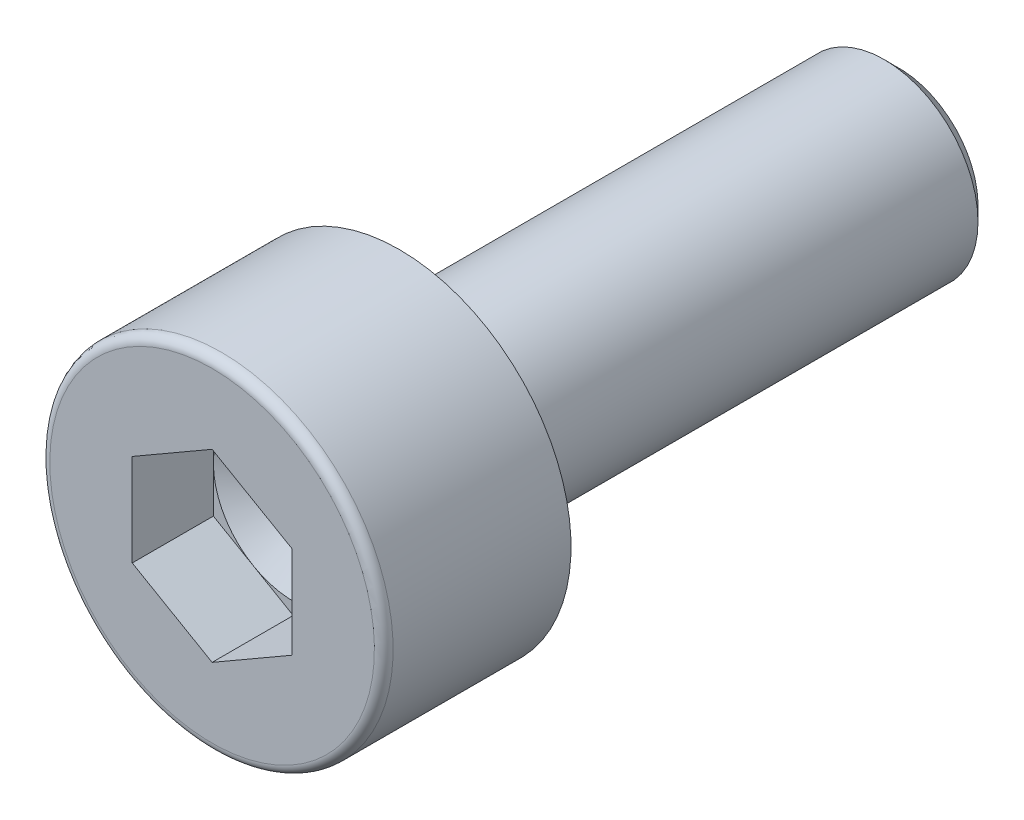
ISO-10303-21;
HEADER;
FILE_DESCRIPTION(('STEP AP214'),'2;1');
FILE_NAME('part.step','',(''),(''),'','','');
FILE_SCHEMA(('AUTOMOTIVE_DESIGN { 1 0 10303 214 1 1 1 1 }'));
ENDSEC;
DATA;
#1=APPLICATION_CONTEXT('core data for automotive mechanical design processes');
#2=APPLICATION_PROTOCOL_DEFINITION('international standard','automotive_design',2000,#1);
#3=PRODUCT_CONTEXT('',#1,'mechanical');
#4=PRODUCT('Part','Part','',(#3));
#5=PRODUCT_RELATED_PRODUCT_CATEGORY('part','',(#4));
#6=PRODUCT_DEFINITION_FORMATION('','',#4);
#7=PRODUCT_DEFINITION_CONTEXT('part definition',#1,'design');
#8=PRODUCT_DEFINITION('design','',#6,#7);
#9=PRODUCT_DEFINITION_SHAPE('','',#8);
#10=(LENGTH_UNIT() NAMED_UNIT(*) SI_UNIT(.MILLI.,.METRE.));
#11=(NAMED_UNIT(*) PLANE_ANGLE_UNIT() SI_UNIT($,.RADIAN.));
#12=(NAMED_UNIT(*) SI_UNIT($,.STERADIAN.) SOLID_ANGLE_UNIT());
#13=UNCERTAINTY_MEASURE_WITH_UNIT(LENGTH_MEASURE(1.E-05),#10,'distance_accuracy_value','');
#14=(GEOMETRIC_REPRESENTATION_CONTEXT(3) GLOBAL_UNCERTAINTY_ASSIGNED_CONTEXT((#13)) GLOBAL_UNIT_ASSIGNED_CONTEXT((#10,
#11,#12)) REPRESENTATION_CONTEXT('',''));
#15=CARTESIAN_POINT('',(0.,0.,0.));
#16=DIRECTION('',(0.,0.,1.));
#17=DIRECTION('',(1.,0.,0.));
#18=AXIS2_PLACEMENT_3D('',#15,#16,#17);
#19=CARTESIAN_POINT('',(0.,1.47801668912544,1.7));
#20=DIRECTION('',(0.,0.,1.));
#21=DIRECTION('',(1.,0.,0.));
#22=AXIS2_PLACEMENT_3D('',#19,#20,#21);
#23=PLANE('',#22);
#24=DIRECTION('',(0.,-1.,0.));
#25=VECTOR('',#24,1.);
#26=CARTESIAN_POINT('',(-1.28,0.739008344562722,1.7));
#27=LINE('',#26,#25);
#28=CARTESIAN_POINT('',(-1.28,0.739008344562722,1.7));
#29=VERTEX_POINT('',#28);
#30=CARTESIAN_POINT('',(-1.28,0.,1.7));
#31=VERTEX_POINT('',#30);
#32=EDGE_CURVE('E145',#29,#31,#27,.T.);
#33=ORIENTED_EDGE('',*,*,#32,.T.);
#34=CARTESIAN_POINT('',(0.,0.,1.7));
#35=DIRECTION('',(0.,0.,-1.));
#36=DIRECTION('',(-1.,0.,0.));
#37=AXIS2_PLACEMENT_3D('',#34,#35,#36);
#38=CIRCLE('',#37,1.28);
#39=CARTESIAN_POINT('',(-0.64,1.10851251684408,1.7));
#40=VERTEX_POINT('',#39);
#41=EDGE_CURVE('E28',#31,#40,#38,.T.);
#42=ORIENTED_EDGE('',*,*,#41,.T.);
#43=DIRECTION('',(-0.866025403784439,-0.5,0.));
#44=VECTOR('',#43,1.);
#45=CARTESIAN_POINT('',(0.,1.47801668912544,1.7));
#46=LINE('',#45,#44);
#47=EDGE_CURVE('E209',#40,#29,#46,.T.);
#48=ORIENTED_EDGE('',*,*,#47,.T.);
#49=EDGE_LOOP('',(#33,#42,#48));
#50=FACE_BOUND('',#49,.T.);
#51=ADVANCED_FACE('F17',(#50),#23,.T.);
#52=CARTESIAN_POINT('',(0.,1.47801668912544,1.7));
#53=VERTEX_POINT('',#52);
#54=EDGE_CURVE('E214',#53,#40,#46,.T.);
#55=ORIENTED_EDGE('',*,*,#54,.T.);
#56=CARTESIAN_POINT('',(0.64,1.10851251684408,1.7));
#57=VERTEX_POINT('',#56);
#58=EDGE_CURVE('E11',#40,#57,#38,.T.);
#59=ORIENTED_EDGE('',*,*,#58,.T.);
#60=DIRECTION('',(-0.866025403784439,0.5,0.));
#61=VECTOR('',#60,1.);
#62=CARTESIAN_POINT('',(1.28,0.739008344562722,1.7));
#63=LINE('',#62,#61);
#64=EDGE_CURVE('E171',#57,#53,#63,.T.);
#65=ORIENTED_EDGE('',*,*,#64,.T.);
#66=EDGE_LOOP('',(#55,#59,#65));
#67=FACE_BOUND('',#66,.T.);
#68=ADVANCED_FACE('F106',(#67),#23,.T.);
#69=CARTESIAN_POINT('',(1.28,0.739008344562722,1.7));
#70=VERTEX_POINT('',#69);
#71=EDGE_CURVE('E215',#70,#57,#63,.T.);
#72=ORIENTED_EDGE('',*,*,#71,.T.);
#73=CARTESIAN_POINT('',(1.28,0.,1.7));
#74=VERTEX_POINT('',#73);
#75=EDGE_CURVE('E26',#57,#74,#38,.T.);
#76=ORIENTED_EDGE('',*,*,#75,.T.);
#77=DIRECTION('',(0.,1.,0.));
#78=VECTOR('',#77,1.);
#79=CARTESIAN_POINT('',(1.28,-0.739008344562722,1.7));
#80=LINE('',#79,#78);
#81=EDGE_CURVE('E150',#74,#70,#80,.T.);
#82=ORIENTED_EDGE('',*,*,#81,.T.);
#83=EDGE_LOOP('',(#72,#76,#82));
#84=FACE_BOUND('',#83,.T.);
#85=ADVANCED_FACE('F113',(#84),#23,.T.);
#86=CARTESIAN_POINT('',(1.28,-0.739008344562722,1.7));
#87=VERTEX_POINT('',#86);
#88=EDGE_CURVE('E151',#87,#74,#80,.T.);
#89=ORIENTED_EDGE('',*,*,#88,.T.);
#90=CARTESIAN_POINT('',(0.64,-1.10851251684408,1.7));
#91=VERTEX_POINT('',#90);
#92=EDGE_CURVE('E206',#74,#91,#38,.T.);
#93=ORIENTED_EDGE('',*,*,#92,.T.);
#94=DIRECTION('',(0.866025403784439,0.5,0.));
#95=VECTOR('',#94,1.);
#96=CARTESIAN_POINT('',(0.,-1.47801668912544,1.7));
#97=LINE('',#96,#95);
#98=EDGE_CURVE('E140',#91,#87,#97,.T.);
#99=ORIENTED_EDGE('',*,*,#98,.T.);
#100=EDGE_LOOP('',(#89,#93,#99));
#101=FACE_BOUND('',#100,.T.);
#102=ADVANCED_FACE('F129',(#101),#23,.T.);
#103=CARTESIAN_POINT('',(0.,-1.47801668912544,1.7));
#104=VERTEX_POINT('',#103);
#105=EDGE_CURVE('E143',#104,#91,#97,.T.);
#106=ORIENTED_EDGE('',*,*,#105,.T.);
#107=CARTESIAN_POINT('',(-0.64,-1.10851251684408,1.7));
#108=VERTEX_POINT('',#107);
#109=EDGE_CURVE('E204',#91,#108,#38,.T.);
#110=ORIENTED_EDGE('',*,*,#109,.T.);
#111=DIRECTION('',(0.866025403784439,-0.5,0.));
#112=VECTOR('',#111,1.);
#113=CARTESIAN_POINT('',(-1.28,-0.739008344562721,1.7));
#114=LINE('',#113,#112);
#115=EDGE_CURVE('E141',#108,#104,#114,.T.);
#116=ORIENTED_EDGE('',*,*,#115,.T.);
#117=EDGE_LOOP('',(#106,#110,#116));
#118=FACE_BOUND('',#117,.T.);
#119=ADVANCED_FACE('F119',(#118),#23,.T.);
#120=CARTESIAN_POINT('',(-1.28,-0.739008344562721,1.7));
#121=VERTEX_POINT('',#120);
#122=EDGE_CURVE('E133',#121,#108,#114,.T.);
#123=ORIENTED_EDGE('',*,*,#122,.T.);
#124=EDGE_CURVE('E134',#108,#31,#38,.T.);
#125=ORIENTED_EDGE('',*,*,#124,.T.);
#126=EDGE_CURVE('E136',#31,#121,#27,.T.);
#127=ORIENTED_EDGE('',*,*,#126,.T.);
#128=EDGE_LOOP('',(#123,#125,#127));
#129=FACE_BOUND('',#128,.T.);
#130=ADVANCED_FACE('F108',(#129),#23,.T.);
#131=CARTESIAN_POINT('',(0.,0.,3.));
#132=DIRECTION('',(0.,0.,-1.));
#133=DIRECTION('',(0.,1.,0.));
#134=AXIS2_PLACEMENT_3D('',#131,#132,#133);
#135=PLANE('',#134);
#136=DIRECTION('',(-0.866025403784439,-0.5,0.));
#137=VECTOR('',#136,1.);
#138=CARTESIAN_POINT('',(0.,1.47801668912544,3.));
#139=LINE('',#138,#137);
#140=CARTESIAN_POINT('',(0.,1.47801668912544,3.));
#141=VERTEX_POINT('',#140);
#142=CARTESIAN_POINT('',(-1.28,0.739008344562722,3.));
#143=VERTEX_POINT('',#142);
#144=EDGE_CURVE('E156',#141,#143,#139,.T.);
#145=ORIENTED_EDGE('',*,*,#144,.F.);
#146=DIRECTION('',(-0.866025403784439,0.5,0.));
#147=VECTOR('',#146,1.);
#148=CARTESIAN_POINT('',(1.28,0.739008344562722,3.));
#149=LINE('',#148,#147);
#150=CARTESIAN_POINT('',(1.28,0.739008344562722,3.));
#151=VERTEX_POINT('',#150);
#152=EDGE_CURVE('E42',#151,#141,#149,.T.);
#153=ORIENTED_EDGE('',*,*,#152,.F.);
#154=DIRECTION('',(0.,1.,0.));
#155=VECTOR('',#154,1.);
#156=CARTESIAN_POINT('',(1.28,-0.739008344562722,3.));
#157=LINE('',#156,#155);
#158=CARTESIAN_POINT('',(1.28,-0.739008344562722,3.));
#159=VERTEX_POINT('',#158);
#160=EDGE_CURVE('E168',#159,#151,#157,.T.);
#161=ORIENTED_EDGE('',*,*,#160,.F.);
#162=DIRECTION('',(0.866025403784439,0.5,0.));
#163=VECTOR('',#162,1.);
#164=CARTESIAN_POINT('',(0.,-1.47801668912544,3.));
#165=LINE('',#164,#163);
#166=CARTESIAN_POINT('',(0.,-1.47801668912544,3.));
#167=VERTEX_POINT('',#166);
#168=EDGE_CURVE('E165',#167,#159,#165,.T.);
#169=ORIENTED_EDGE('',*,*,#168,.F.);
#170=DIRECTION('',(0.866025403784439,-0.5,0.));
#171=VECTOR('',#170,1.);
#172=CARTESIAN_POINT('',(-1.28,-0.739008344562721,3.));
#173=LINE('',#172,#171);
#174=CARTESIAN_POINT('',(-1.28,-0.739008344562721,3.));
#175=VERTEX_POINT('',#174);
#176=EDGE_CURVE('E162',#175,#167,#173,.T.);
#177=ORIENTED_EDGE('',*,*,#176,.F.);
#178=DIRECTION('',(0.,-1.,0.));
#179=VECTOR('',#178,1.);
#180=CARTESIAN_POINT('',(-1.28,0.739008344562722,3.));
#181=LINE('',#180,#179);
#182=EDGE_CURVE('E159',#143,#175,#181,.T.);
#183=ORIENTED_EDGE('',*,*,#182,.F.);
#184=EDGE_LOOP('',(#145,#153,#161,#169,#177,#183));
#185=FACE_BOUND('',#184,.T.);
#186=CARTESIAN_POINT('',(0.,0.,3.));
#187=DIRECTION('',(0.,0.,-1.));
#188=DIRECTION('',(0.,1.,0.));
#189=AXIS2_PLACEMENT_3D('',#186,#187,#188);
#190=CIRCLE('',#189,2.6);
#191=CARTESIAN_POINT('',(0.,2.6,3.));
#192=VERTEX_POINT('',#191);
#193=EDGE_CURVE('E192',#192,#192,#190,.F.);
#194=ORIENTED_EDGE('',*,*,#193,.T.);
#195=EDGE_LOOP('',(#194));
#196=FACE_BOUND('',#195,.T.);
#197=ADVANCED_FACE('F118',(#185,#196),#135,.F.);
#198=CARTESIAN_POINT('',(0.,0.,3.));
#199=DIRECTION('',(0.,0.,1.));
#200=DIRECTION('',(0.,-1.,0.));
#201=AXIS2_PLACEMENT_3D('',#198,#199,#200);
#202=CYLINDRICAL_SURFACE('',#201,2.75);
#203=CARTESIAN_POINT('',(0.,0.,2.85));
#204=DIRECTION('',(0.,0.,-1.));
#205=DIRECTION('',(0.,1.,0.));
#206=AXIS2_PLACEMENT_3D('',#203,#204,#205);
#207=CIRCLE('',#206,2.75);
#208=CARTESIAN_POINT('',(0.,2.75,2.85));
#209=VERTEX_POINT('',#208);
#210=EDGE_CURVE('E195',#209,#209,#207,.T.);
#211=ORIENTED_EDGE('',*,*,#210,.T.);
#212=EDGE_LOOP('',(#211));
#213=FACE_BOUND('',#212,.T.);
#214=CARTESIAN_POINT('',(0.,0.,0.));
#215=DIRECTION('',(0.,0.,1.));
#216=DIRECTION('',(0.,-1.,0.));
#217=AXIS2_PLACEMENT_3D('',#214,#215,#216);
#218=CIRCLE('',#217,2.75);
#219=CARTESIAN_POINT('',(0.,-2.75,0.));
#220=VERTEX_POINT('',#219);
#221=EDGE_CURVE('E174',#220,#220,#218,.T.);
#222=ORIENTED_EDGE('',*,*,#221,.T.);
#223=EDGE_LOOP('',(#222));
#224=FACE_BOUND('',#223,.T.);
#225=ADVANCED_FACE('F126',(#213,#224),#202,.T.);
#226=CARTESIAN_POINT('',(0.,2.75,0.));
#227=DIRECTION('',(0.,0.,1.));
#228=DIRECTION('',(0.,-1.,0.));
#229=AXIS2_PLACEMENT_3D('',#226,#227,#228);
#230=PLANE('',#229);
#231=CARTESIAN_POINT('',(0.,0.,0.));
#232=DIRECTION('',(0.,0.,1.));
#233=DIRECTION('',(0.,-1.,0.));
#234=AXIS2_PLACEMENT_3D('',#231,#232,#233);
#235=CIRCLE('',#234,1.6);
#236=CARTESIAN_POINT('',(0.,-1.6,0.));
#237=VERTEX_POINT('',#236);
#238=EDGE_CURVE('E197',#237,#237,#235,.T.);
#239=ORIENTED_EDGE('',*,*,#238,.T.);
#240=EDGE_LOOP('',(#239));
#241=FACE_BOUND('',#240,.T.);
#242=ORIENTED_EDGE('',*,*,#221,.F.);
#243=EDGE_LOOP('',(#242));
#244=FACE_BOUND('',#243,.T.);
#245=ADVANCED_FACE('F264',(#241,#244),#230,.F.);
#246=CARTESIAN_POINT('',(0.,0.,3.));
#247=DIRECTION('',(0.,0.,1.));
#248=DIRECTION('',(0.,-1.,0.));
#249=AXIS2_PLACEMENT_3D('',#246,#247,#248);
#250=CYLINDRICAL_SURFACE('',#249,1.5);
#251=CARTESIAN_POINT('',(0.,0.,-0.1));
#252=DIRECTION('',(0.,0.,1.));
#253=DIRECTION('',(0.,-1.,0.));
#254=AXIS2_PLACEMENT_3D('',#251,#252,#253);
#255=CIRCLE('',#254,1.5);
#256=CARTESIAN_POINT('',(0.,-1.5,-0.1));
#257=VERTEX_POINT('',#256);
#258=EDGE_CURVE('E21',#257,#257,#255,.F.);
#259=ORIENTED_EDGE('',*,*,#258,.T.);
#260=EDGE_LOOP('',(#259));
#261=FACE_BOUND('',#260,.T.);
#262=CARTESIAN_POINT('',(0.,0.,-7.77));
#263=DIRECTION('',(0.,0.,1.));
#264=DIRECTION('',(0.,-1.,0.));
#265=AXIS2_PLACEMENT_3D('',#262,#263,#264);
#266=CIRCLE('',#265,1.5);
#267=CARTESIAN_POINT('',(0.,-1.5,-7.77));
#268=VERTEX_POINT('',#267);
#269=EDGE_CURVE('E186',#268,#268,#266,.T.);
#270=ORIENTED_EDGE('',*,*,#269,.T.);
#271=EDGE_LOOP('',(#270));
#272=FACE_BOUND('',#271,.T.);
#273=ADVANCED_FACE('F260',(#261,#272),#250,.T.);
#274=CARTESIAN_POINT('',(0.,1.5,-8.));
#275=DIRECTION('',(0.,0.,1.));
#276=DIRECTION('',(0.,-1.,0.));
#277=AXIS2_PLACEMENT_3D('',#274,#275,#276);
#278=PLANE('',#277);
#279=CARTESIAN_POINT('',(0.,0.,-8.));
#280=DIRECTION('',(0.,0.,1.));
#281=DIRECTION('',(0.,-1.,0.));
#282=AXIS2_PLACEMENT_3D('',#279,#280,#281);
#283=CIRCLE('',#282,1.27);
#284=CARTESIAN_POINT('',(0.,-1.27,-8.));
#285=VERTEX_POINT('',#284);
#286=EDGE_CURVE('E189',#285,#285,#283,.F.);
#287=ORIENTED_EDGE('',*,*,#286,.T.);
#288=EDGE_LOOP('',(#287));
#289=FACE_BOUND('',#288,.T.);
#290=ADVANCED_FACE('F256',(#289),#278,.F.);
#291=CARTESIAN_POINT('',(0.,0.,-7.77));
#292=DIRECTION('',(0.,0.,1.));
#293=DIRECTION('',(0.,-1.,0.));
#294=AXIS2_PLACEMENT_3D('',#291,#292,#293);
#295=CONICAL_SURFACE('',#294,1.5,0.785398163397448);
#296=ORIENTED_EDGE('',*,*,#286,.F.);
#297=EDGE_LOOP('',(#296));
#298=FACE_BOUND('',#297,.T.);
#299=ORIENTED_EDGE('',*,*,#269,.F.);
#300=EDGE_LOOP('',(#299));
#301=FACE_BOUND('',#300,.T.);
#302=ADVANCED_FACE('F259',(#298,#301),#295,.T.);
#303=CARTESIAN_POINT('',(0.,0.,2.85));
#304=DIRECTION('',(0.,0.,-1.));
#305=DIRECTION('',(0.,1.,0.));
#306=AXIS2_PLACEMENT_3D('',#303,#304,#305);
#307=TOROIDAL_SURFACE('',#306,2.6,0.15);
#308=ORIENTED_EDGE('',*,*,#210,.F.);
#309=EDGE_LOOP('',(#308));
#310=FACE_BOUND('',#309,.T.);
#311=ORIENTED_EDGE('',*,*,#193,.F.);
#312=EDGE_LOOP('',(#311));
#313=FACE_BOUND('',#312,.T.);
#314=ADVANCED_FACE('F271',(#310,#313),#307,.T.);
#315=CARTESIAN_POINT('',(0.,0.,-0.1));
#316=DIRECTION('',(0.,0.,1.));
#317=DIRECTION('',(0.,-1.,0.));
#318=AXIS2_PLACEMENT_3D('',#315,#316,#317);
#319=TOROIDAL_SURFACE('',#318,1.6,0.1);
#320=ORIENTED_EDGE('',*,*,#258,.F.);
#321=EDGE_LOOP('',(#320));
#322=FACE_BOUND('',#321,.T.);
#323=ORIENTED_EDGE('',*,*,#238,.F.);
#324=EDGE_LOOP('',(#323));
#325=FACE_BOUND('',#324,.T.);
#326=ADVANCED_FACE('F19',(#322,#325),#319,.F.);
#327=CARTESIAN_POINT('',(1.28,0.739008344562722,1.7));
#328=DIRECTION('',(0.5,0.866025403784439,0.));
#329=DIRECTION('',(-0.866025403784439,0.5,0.));
#330=AXIS2_PLACEMENT_3D('',#327,#328,#329);
#331=PLANE('',#330);
#332=ORIENTED_EDGE('',*,*,#152,.T.);
#333=DIRECTION('',(0.,0.,1.));
#334=VECTOR('',#333,1.);
#335=CARTESIAN_POINT('',(0.,1.47801668912544,1.7));
#336=LINE('',#335,#334);
#337=EDGE_CURVE('E154',#53,#141,#336,.T.);
#338=ORIENTED_EDGE('',*,*,#337,.F.);
#339=ORIENTED_EDGE('',*,*,#64,.F.);
#340=ORIENTED_EDGE('',*,*,#71,.F.);
#341=DIRECTION('',(0.,0.,1.));
#342=VECTOR('',#341,1.);
#343=CARTESIAN_POINT('',(1.28,0.739008344562722,1.7));
#344=LINE('',#343,#342);
#345=EDGE_CURVE('E172',#70,#151,#344,.T.);
#346=ORIENTED_EDGE('',*,*,#345,.T.);
#347=EDGE_LOOP('',(#332,#338,#339,#340,#346));
#348=FACE_BOUND('',#347,.T.);
#349=ADVANCED_FACE('F223',(#348),#331,.F.);
#350=CARTESIAN_POINT('',(1.28,-0.739008344562722,1.7));
#351=DIRECTION('',(1.,0.,0.));
#352=DIRECTION('',(0.,1.,0.));
#353=AXIS2_PLACEMENT_3D('',#350,#351,#352);
#354=PLANE('',#353);
#355=ORIENTED_EDGE('',*,*,#160,.T.);
#356=ORIENTED_EDGE('',*,*,#345,.F.);
#357=ORIENTED_EDGE('',*,*,#81,.F.);
#358=ORIENTED_EDGE('',*,*,#88,.F.);
#359=DIRECTION('',(0.,0.,1.));
#360=VECTOR('',#359,1.);
#361=CARTESIAN_POINT('',(1.28,-0.739008344562722,1.7));
#362=LINE('',#361,#360);
#363=EDGE_CURVE('E175',#87,#159,#362,.T.);
#364=ORIENTED_EDGE('',*,*,#363,.T.);
#365=EDGE_LOOP('',(#355,#356,#357,#358,#364));
#366=FACE_BOUND('',#365,.T.);
#367=ADVANCED_FACE('F242',(#366),#354,.F.);
#368=CARTESIAN_POINT('',(0.,-1.47801668912544,1.7));
#369=DIRECTION('',(0.5,-0.866025403784439,0.));
#370=DIRECTION('',(0.866025403784439,0.5,0.));
#371=AXIS2_PLACEMENT_3D('',#368,#369,#370);
#372=PLANE('',#371);
#373=ORIENTED_EDGE('',*,*,#168,.T.);
#374=ORIENTED_EDGE('',*,*,#363,.F.);
#375=ORIENTED_EDGE('',*,*,#98,.F.);
#376=ORIENTED_EDGE('',*,*,#105,.F.);
#377=DIRECTION('',(0.,0.,1.));
#378=VECTOR('',#377,1.);
#379=CARTESIAN_POINT('',(0.,-1.47801668912544,1.7));
#380=LINE('',#379,#378);
#381=EDGE_CURVE('E177',#104,#167,#380,.T.);
#382=ORIENTED_EDGE('',*,*,#381,.T.);
#383=EDGE_LOOP('',(#373,#374,#375,#376,#382));
#384=FACE_BOUND('',#383,.T.);
#385=ADVANCED_FACE('F236',(#384),#372,.F.);
#386=CARTESIAN_POINT('',(-1.28,-0.739008344562721,1.7));
#387=DIRECTION('',(-0.5,-0.866025403784439,0.));
#388=DIRECTION('',(0.866025403784439,-0.5,0.));
#389=AXIS2_PLACEMENT_3D('',#386,#387,#388);
#390=PLANE('',#389);
#391=ORIENTED_EDGE('',*,*,#176,.T.);
#392=ORIENTED_EDGE('',*,*,#381,.F.);
#393=ORIENTED_EDGE('',*,*,#115,.F.);
#394=ORIENTED_EDGE('',*,*,#122,.F.);
#395=DIRECTION('',(0.,0.,1.));
#396=VECTOR('',#395,1.);
#397=CARTESIAN_POINT('',(-1.28,-0.739008344562721,1.7));
#398=LINE('',#397,#396);
#399=EDGE_CURVE('E179',#121,#175,#398,.T.);
#400=ORIENTED_EDGE('',*,*,#399,.T.);
#401=EDGE_LOOP('',(#391,#392,#393,#394,#400));
#402=FACE_BOUND('',#401,.T.);
#403=ADVANCED_FACE('F231',(#402),#390,.F.);
#404=CARTESIAN_POINT('',(-1.28,0.739008344562722,1.7));
#405=DIRECTION('',(-1.,0.,0.));
#406=DIRECTION('',(0.,0.,1.));
#407=AXIS2_PLACEMENT_3D('',#404,#405,#406);
#408=PLANE('',#407);
#409=ORIENTED_EDGE('',*,*,#182,.T.);
#410=ORIENTED_EDGE('',*,*,#399,.F.);
#411=ORIENTED_EDGE('',*,*,#126,.F.);
#412=ORIENTED_EDGE('',*,*,#32,.F.);
#413=DIRECTION('',(0.,0.,1.));
#414=VECTOR('',#413,1.);
#415=CARTESIAN_POINT('',(-1.28,0.739008344562722,1.7));
#416=LINE('',#415,#414);
#417=EDGE_CURVE('E181',#29,#143,#416,.T.);
#418=ORIENTED_EDGE('',*,*,#417,.T.);
#419=EDGE_LOOP('',(#409,#410,#411,#412,#418));
#420=FACE_BOUND('',#419,.T.);
#421=ADVANCED_FACE('F101',(#420),#408,.F.);
#422=CARTESIAN_POINT('',(0.,1.47801668912544,1.7));
#423=DIRECTION('',(-0.5,0.866025403784439,0.));
#424=DIRECTION('',(-0.866025403784439,-0.5,0.));
#425=AXIS2_PLACEMENT_3D('',#422,#423,#424);
#426=PLANE('',#425);
#427=ORIENTED_EDGE('',*,*,#144,.T.);
#428=ORIENTED_EDGE('',*,*,#417,.F.);
#429=ORIENTED_EDGE('',*,*,#47,.F.);
#430=ORIENTED_EDGE('',*,*,#54,.F.);
#431=ORIENTED_EDGE('',*,*,#337,.T.);
#432=EDGE_LOOP('',(#427,#428,#429,#430,#431));
#433=FACE_BOUND('',#432,.T.);
#434=ADVANCED_FACE('F94',(#433),#426,.F.);
#435=CARTESIAN_POINT('',(0.,0.,0.960991655437276));
#436=DIRECTION('',(0.,0.,1.));
#437=DIRECTION('',(1.,0.,0.));
#438=AXIS2_PLACEMENT_3D('',#435,#436,#437);
#439=CONICAL_SURFACE('',#438,0.,1.0471975511966);
#440=ORIENTED_EDGE('',*,*,#41,.F.);
#441=ORIENTED_EDGE('',*,*,#124,.F.);
#442=ORIENTED_EDGE('',*,*,#109,.F.);
#443=ORIENTED_EDGE('',*,*,#92,.F.);
#444=ORIENTED_EDGE('',*,*,#75,.F.);
#445=ORIENTED_EDGE('',*,*,#58,.F.);
#446=EDGE_LOOP('',(#440,#441,#442,#443,#444,#445));
#447=FACE_BOUND('',#446,.T.);
#448=CARTESIAN_POINT('',(0.,0.,0.960991655437276));
#449=VERTEX_POINT('',#448);
#450=VERTEX_LOOP('',#449);
#451=FACE_BOUND('',#450,.T.);
#452=ADVANCED_FACE('F92',(#447,#451),#439,.F.);
#453=CLOSED_SHELL('',(#51,#68,#85,#102,#119,#130,#197,#225,#245,#273,#290,#302,#314,#326,#349,
#367,#385,#403,#421,#434,#452));
#454=MANIFOLD_SOLID_BREP('B1',#453);
#455=ADVANCED_BREP_SHAPE_REPRESENTATION('',(#18,#454),#14);
#456=SHAPE_DEFINITION_REPRESENTATION(#9,#455);
ENDSEC;
END-ISO-10303-21;
